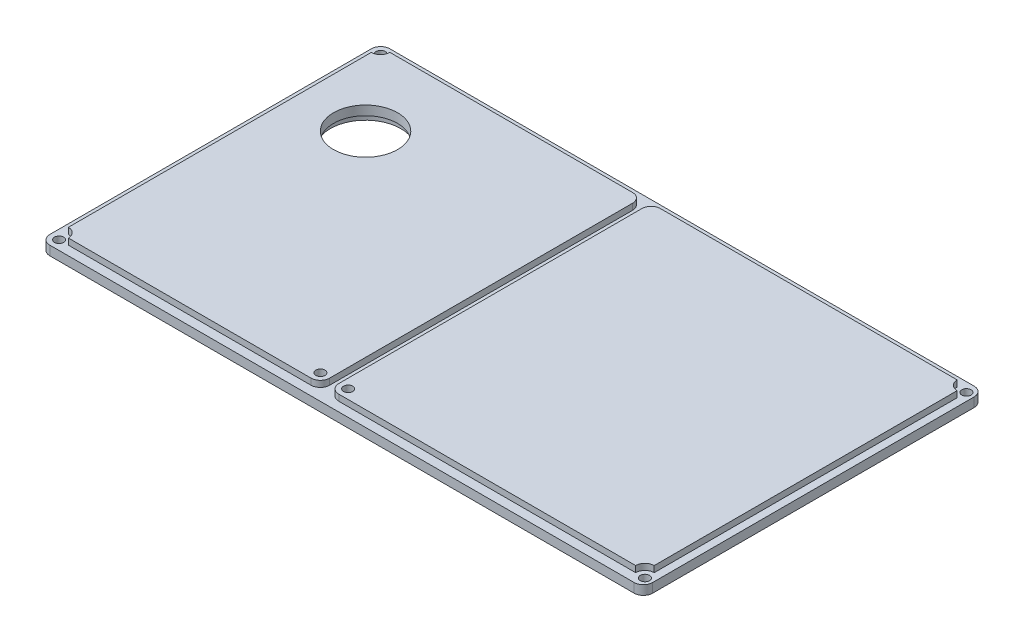
ISO-10303-21;
HEADER;
FILE_DESCRIPTION(('STEP AP214'),'2;1');
FILE_NAME('part.step','',(''),(''),'','','');
FILE_SCHEMA(('AUTOMOTIVE_DESIGN { 1 0 10303 214 1 1 1 1 }'));
ENDSEC;
DATA;
#1=APPLICATION_CONTEXT('core data for automotive mechanical design processes');
#2=APPLICATION_PROTOCOL_DEFINITION('international standard','automotive_design',2000,#1);
#3=PRODUCT_CONTEXT('',#1,'mechanical');
#4=PRODUCT('Part','Part','',(#3));
#5=PRODUCT_RELATED_PRODUCT_CATEGORY('part','',(#4));
#6=PRODUCT_DEFINITION_FORMATION('','',#4);
#7=PRODUCT_DEFINITION_CONTEXT('part definition',#1,'design');
#8=PRODUCT_DEFINITION('design','',#6,#7);
#9=PRODUCT_DEFINITION_SHAPE('','',#8);
#10=(LENGTH_UNIT() NAMED_UNIT(*) SI_UNIT(.MILLI.,.METRE.));
#11=(NAMED_UNIT(*) PLANE_ANGLE_UNIT() SI_UNIT($,.RADIAN.));
#12=(NAMED_UNIT(*) SI_UNIT($,.STERADIAN.) SOLID_ANGLE_UNIT());
#13=UNCERTAINTY_MEASURE_WITH_UNIT(LENGTH_MEASURE(1.E-05),#10,'distance_accuracy_value','');
#14=(GEOMETRIC_REPRESENTATION_CONTEXT(3) GLOBAL_UNCERTAINTY_ASSIGNED_CONTEXT((#13)) GLOBAL_UNIT_ASSIGNED_CONTEXT((#10,
#11,#12)) REPRESENTATION_CONTEXT('',''));
#15=CARTESIAN_POINT('',(0.,0.,0.));
#16=DIRECTION('',(0.,0.,1.));
#17=DIRECTION('',(1.,0.,0.));
#18=AXIS2_PLACEMENT_3D('',#15,#16,#17);
#19=CARTESIAN_POINT('',(-73.375,0.,-26.));
#20=DIRECTION('',(0.,1.,0.));
#21=DIRECTION('',(0.,0.,1.));
#22=AXIS2_PLACEMENT_3D('',#19,#20,#21);
#23=CYLINDRICAL_SURFACE('',#22,10.35);
#24=CARTESIAN_POINT('',(-73.375,5.,-26.));
#25=DIRECTION('',(0.,1.,0.));
#26=DIRECTION('',(0.,0.,1.));
#27=AXIS2_PLACEMENT_3D('',#24,#25,#26);
#28=CIRCLE('',#27,10.35);
#29=CARTESIAN_POINT('',(-73.375,5.,-15.65));
#30=VERTEX_POINT('',#29);
#31=EDGE_CURVE('E718',#30,#30,#28,.T.);
#32=ORIENTED_EDGE('',*,*,#31,.T.);
#33=EDGE_LOOP('',(#32));
#34=FACE_BOUND('',#33,.T.);
#35=CARTESIAN_POINT('',(-73.375,2.,-26.));
#36=DIRECTION('',(0.,-1.,0.));
#37=DIRECTION('',(0.,0.,-1.));
#38=AXIS2_PLACEMENT_3D('',#35,#36,#37);
#39=CIRCLE('',#38,10.35);
#40=CARTESIAN_POINT('',(-73.375,2.,-36.35));
#41=VERTEX_POINT('',#40);
#42=EDGE_CURVE('E41',#41,#41,#39,.F.);
#43=ORIENTED_EDGE('',*,*,#42,.F.);
#44=EDGE_LOOP('',(#43));
#45=FACE_BOUND('',#44,.T.);
#46=ADVANCED_FACE('F37',(#34,#45),#23,.F.);
#47=CARTESIAN_POINT('',(0.,3.,0.));
#48=DIRECTION('',(0.,1.,0.));
#49=DIRECTION('',(0.,0.,1.));
#50=AXIS2_PLACEMENT_3D('',#47,#48,#49);
#51=PLANE('',#50);
#52=CARTESIAN_POINT('',(-94.5,3.,52.));
#53=DIRECTION('',(0.,1.,0.));
#54=DIRECTION('',(0.,0.,1.));
#55=AXIS2_PLACEMENT_3D('',#52,#53,#54);
#56=CIRCLE('',#55,1.5);
#57=CARTESIAN_POINT('',(-94.5,3.,53.5));
#58=VERTEX_POINT('',#57);
#59=EDGE_CURVE('E746',#58,#58,#56,.T.);
#60=ORIENTED_EDGE('',*,*,#59,.F.);
#61=EDGE_LOOP('',(#60));
#62=FACE_BOUND('',#61,.T.);
#63=CARTESIAN_POINT('',(95.,3.,52.));
#64=DIRECTION('',(0.,1.,0.));
#65=DIRECTION('',(0.,0.,1.));
#66=AXIS2_PLACEMENT_3D('',#63,#64,#65);
#67=CIRCLE('',#66,1.5);
#68=CARTESIAN_POINT('',(95.,3.,53.5));
#69=VERTEX_POINT('',#68);
#70=EDGE_CURVE('E740',#69,#69,#67,.T.);
#71=ORIENTED_EDGE('',*,*,#70,.F.);
#72=EDGE_LOOP('',(#71));
#73=FACE_BOUND('',#72,.T.);
#74=CARTESIAN_POINT('',(95.,3.,-52.));
#75=DIRECTION('',(0.,1.,0.));
#76=DIRECTION('',(0.,0.,1.));
#77=AXIS2_PLACEMENT_3D('',#74,#75,#76);
#78=CIRCLE('',#77,1.5);
#79=CARTESIAN_POINT('',(95.,3.,-50.5));
#80=VERTEX_POINT('',#79);
#81=EDGE_CURVE('E733',#80,#80,#78,.T.);
#82=ORIENTED_EDGE('',*,*,#81,.F.);
#83=EDGE_LOOP('',(#82));
#84=FACE_BOUND('',#83,.T.);
#85=CARTESIAN_POINT('',(-94.5,3.,-52.));
#86=DIRECTION('',(0.,1.,0.));
#87=DIRECTION('',(0.,0.,1.));
#88=AXIS2_PLACEMENT_3D('',#85,#86,#87);
#89=CIRCLE('',#88,1.5);
#90=CARTESIAN_POINT('',(-94.5,3.,-50.5));
#91=VERTEX_POINT('',#90);
#92=EDGE_CURVE('E736',#91,#91,#89,.T.);
#93=ORIENTED_EDGE('',*,*,#92,.F.);
#94=EDGE_LOOP('',(#93));
#95=FACE_BOUND('',#94,.T.);
#96=DIRECTION('',(0.,0.,1.));
#97=VECTOR('',#96,1.);
#98=CARTESIAN_POINT('',(-97.5,3.,-55.));
#99=LINE('',#98,#97);
#100=CARTESIAN_POINT('',(-97.5,3.,-52.));
#101=VERTEX_POINT('',#100);
#102=CARTESIAN_POINT('',(-97.5,3.,52.));
#103=VERTEX_POINT('',#102);
#104=EDGE_CURVE('E321',#101,#103,#99,.T.);
#105=ORIENTED_EDGE('',*,*,#104,.T.);
#106=CARTESIAN_POINT('',(-94.5,3.,52.));
#107=DIRECTION('',(0.,1.,0.));
#108=DIRECTION('',(0.,0.,1.));
#109=AXIS2_PLACEMENT_3D('',#106,#107,#108);
#110=CIRCLE('',#109,3.);
#111=CARTESIAN_POINT('',(-94.5,3.,55.));
#112=VERTEX_POINT('',#111);
#113=EDGE_CURVE('E359',#103,#112,#110,.T.);
#114=ORIENTED_EDGE('',*,*,#113,.T.);
#115=DIRECTION('',(1.,0.,0.));
#116=VECTOR('',#115,1.);
#117=CARTESIAN_POINT('',(-97.5,3.,55.));
#118=LINE('',#117,#116);
#119=CARTESIAN_POINT('',(94.5,3.,55.));
#120=VERTEX_POINT('',#119);
#121=EDGE_CURVE('E324',#112,#120,#118,.T.);
#122=ORIENTED_EDGE('',*,*,#121,.T.);
#123=CARTESIAN_POINT('',(94.5,3.,52.));
#124=DIRECTION('',(0.,1.,0.));
#125=DIRECTION('',(0.,0.,1.));
#126=AXIS2_PLACEMENT_3D('',#123,#124,#125);
#127=CIRCLE('',#126,3.);
#128=CARTESIAN_POINT('',(97.5,3.,52.));
#129=VERTEX_POINT('',#128);
#130=EDGE_CURVE('E357',#120,#129,#127,.T.);
#131=ORIENTED_EDGE('',*,*,#130,.T.);
#132=DIRECTION('',(0.,0.,-1.));
#133=VECTOR('',#132,1.);
#134=CARTESIAN_POINT('',(97.5,3.,-55.));
#135=LINE('',#134,#133);
#136=CARTESIAN_POINT('',(97.5,3.,-52.));
#137=VERTEX_POINT('',#136);
#138=EDGE_CURVE('E316',#129,#137,#135,.T.);
#139=ORIENTED_EDGE('',*,*,#138,.T.);
#140=CARTESIAN_POINT('',(94.5,3.,-52.));
#141=DIRECTION('',(0.,1.,0.));
#142=DIRECTION('',(0.,0.,1.));
#143=AXIS2_PLACEMENT_3D('',#140,#141,#142);
#144=CIRCLE('',#143,3.);
#145=CARTESIAN_POINT('',(94.5,3.,-55.));
#146=VERTEX_POINT('',#145);
#147=EDGE_CURVE('E59',#137,#146,#144,.T.);
#148=ORIENTED_EDGE('',*,*,#147,.T.);
#149=DIRECTION('',(-1.,0.,0.));
#150=VECTOR('',#149,1.);
#151=CARTESIAN_POINT('',(-97.5,3.,-55.));
#152=LINE('',#151,#150);
#153=CARTESIAN_POINT('',(-94.5,3.,-55.));
#154=VERTEX_POINT('',#153);
#155=EDGE_CURVE('E318',#146,#154,#152,.T.);
#156=ORIENTED_EDGE('',*,*,#155,.T.);
#157=CARTESIAN_POINT('',(-94.5,3.,-52.));
#158=DIRECTION('',(0.,1.,0.));
#159=DIRECTION('',(0.,0.,1.));
#160=AXIS2_PLACEMENT_3D('',#157,#158,#159);
#161=CIRCLE('',#160,3.);
#162=EDGE_CURVE('E354',#154,#101,#161,.T.);
#163=ORIENTED_EDGE('',*,*,#162,.T.);
#164=EDGE_LOOP('',(#105,#114,#122,#131,#139,#148,#156,#163));
#165=FACE_BOUND('',#164,.T.);
#166=DIRECTION('',(1.,0.,0.));
#167=VECTOR('',#166,1.);
#168=CARTESIAN_POINT('',(-13.,3.,52.));
#169=LINE('',#168,#167);
#170=CARTESIAN_POINT('',(-91.4999999999999,3.,52.));
#171=VERTEX_POINT('',#170);
#172=CARTESIAN_POINT('',(-13.,3.,52.));
#173=VERTEX_POINT('',#172);
#174=EDGE_CURVE('E279',#171,#173,#169,.T.);
#175=ORIENTED_EDGE('',*,*,#174,.F.);
#176=CARTESIAN_POINT('',(-94.5,3.,52.));
#177=DIRECTION('',(0.,-1.,0.));
#178=DIRECTION('',(0.,0.,1.));
#179=AXIS2_PLACEMENT_3D('',#176,#177,#178);
#180=CIRCLE('',#179,3.00000000000002);
#181=CARTESIAN_POINT('',(-94.5,3.,49.));
#182=VERTEX_POINT('',#181);
#183=EDGE_CURVE('E242',#182,#171,#180,.T.);
#184=ORIENTED_EDGE('',*,*,#183,.F.);
#185=DIRECTION('',(0.,0.,1.));
#186=VECTOR('',#185,1.);
#187=CARTESIAN_POINT('',(-94.5,3.,0.));
#188=LINE('',#187,#186);
#189=CARTESIAN_POINT('',(-94.5,3.,-49.));
#190=VERTEX_POINT('',#189);
#191=EDGE_CURVE('E262',#190,#182,#188,.T.);
#192=ORIENTED_EDGE('',*,*,#191,.F.);
#193=CARTESIAN_POINT('',(-94.5,3.,-52.));
#194=DIRECTION('',(0.,-1.,0.));
#195=DIRECTION('',(0.,0.,1.));
#196=AXIS2_PLACEMENT_3D('',#193,#194,#195);
#197=CIRCLE('',#196,3.00000000000002);
#198=CARTESIAN_POINT('',(-91.4999999999999,3.,-52.));
#199=VERTEX_POINT('',#198);
#200=EDGE_CURVE('E289',#199,#190,#197,.T.);
#201=ORIENTED_EDGE('',*,*,#200,.F.);
#202=DIRECTION('',(-1.,0.,0.));
#203=VECTOR('',#202,1.);
#204=CARTESIAN_POINT('',(-91.4999999999999,3.,-52.));
#205=LINE('',#204,#203);
#206=CARTESIAN_POINT('',(-13.,3.,-52.));
#207=VERTEX_POINT('',#206);
#208=EDGE_CURVE('E287',#207,#199,#205,.T.);
#209=ORIENTED_EDGE('',*,*,#208,.F.);
#210=CARTESIAN_POINT('',(-13.,3.,-49.));
#211=DIRECTION('',(0.,1.,0.));
#212=DIRECTION('',(0.,0.,-1.));
#213=AXIS2_PLACEMENT_3D('',#210,#211,#212);
#214=CIRCLE('',#213,3.);
#215=CARTESIAN_POINT('',(-9.99999999999997,3.,-49.));
#216=VERTEX_POINT('',#215);
#217=EDGE_CURVE('E285',#216,#207,#214,.T.);
#218=ORIENTED_EDGE('',*,*,#217,.F.);
#219=DIRECTION('',(0.,0.,-1.));
#220=VECTOR('',#219,1.);
#221=CARTESIAN_POINT('',(-9.99999999999997,3.,-49.));
#222=LINE('',#221,#220);
#223=CARTESIAN_POINT('',(-9.99999999999995,3.,49.));
#224=VERTEX_POINT('',#223);
#225=EDGE_CURVE('E283',#224,#216,#222,.T.);
#226=ORIENTED_EDGE('',*,*,#225,.F.);
#227=CARTESIAN_POINT('',(-13.,3.,49.));
#228=DIRECTION('',(0.,1.,0.));
#229=DIRECTION('',(0.,0.,1.));
#230=AXIS2_PLACEMENT_3D('',#227,#228,#229);
#231=CIRCLE('',#230,3.);
#232=EDGE_CURVE('E281',#173,#224,#231,.T.);
#233=ORIENTED_EDGE('',*,*,#232,.F.);
#234=EDGE_LOOP('',(#175,#184,#192,#201,#209,#218,#226,#233));
#235=FACE_BOUND('',#234,.T.);
#236=DIRECTION('',(1.,0.,0.));
#237=VECTOR('',#236,1.);
#238=CARTESIAN_POINT('',(-3.99999999999994,3.,52.));
#239=LINE('',#238,#237);
#240=CARTESIAN_POINT('',(-3.99999999999994,3.,52.));
#241=VERTEX_POINT('',#240);
#242=CARTESIAN_POINT('',(92.,3.,52.));
#243=VERTEX_POINT('',#242);
#244=EDGE_CURVE('E238',#241,#243,#239,.T.);
#245=ORIENTED_EDGE('',*,*,#244,.F.);
#246=CARTESIAN_POINT('',(-3.99999999999996,3.,49.));
#247=DIRECTION('',(0.,1.,0.));
#248=DIRECTION('',(0.,0.,1.));
#249=AXIS2_PLACEMENT_3D('',#246,#247,#248);
#250=CIRCLE('',#249,3.);
#251=CARTESIAN_POINT('',(-6.99999999999996,3.,49.));
#252=VERTEX_POINT('',#251);
#253=EDGE_CURVE('E240',#252,#241,#250,.T.);
#254=ORIENTED_EDGE('',*,*,#253,.F.);
#255=DIRECTION('',(0.,0.,1.));
#256=VECTOR('',#255,1.);
#257=CARTESIAN_POINT('',(-6.99999999999996,3.,0.));
#258=LINE('',#257,#256);
#259=CARTESIAN_POINT('',(-6.99999999999996,3.,-49.));
#260=VERTEX_POINT('',#259);
#261=EDGE_CURVE('E227',#260,#252,#258,.T.);
#262=ORIENTED_EDGE('',*,*,#261,.F.);
#263=CARTESIAN_POINT('',(-3.99999999999996,3.,-49.));
#264=DIRECTION('',(0.,1.,0.));
#265=DIRECTION('',(0.,0.,1.));
#266=AXIS2_PLACEMENT_3D('',#263,#264,#265);
#267=CIRCLE('',#266,3.);
#268=CARTESIAN_POINT('',(-3.99999999999994,3.,-52.));
#269=VERTEX_POINT('',#268);
#270=EDGE_CURVE('E213',#269,#260,#267,.T.);
#271=ORIENTED_EDGE('',*,*,#270,.F.);
#272=DIRECTION('',(-1.,0.,0.));
#273=VECTOR('',#272,1.);
#274=CARTESIAN_POINT('',(-3.99999999999994,3.,-52.));
#275=LINE('',#274,#273);
#276=CARTESIAN_POINT('',(92.,3.,-52.));
#277=VERTEX_POINT('',#276);
#278=EDGE_CURVE('E201',#277,#269,#275,.T.);
#279=ORIENTED_EDGE('',*,*,#278,.F.);
#280=CARTESIAN_POINT('',(95.,3.,-52.));
#281=DIRECTION('',(0.,-1.,0.));
#282=DIRECTION('',(0.,0.,1.));
#283=AXIS2_PLACEMENT_3D('',#280,#281,#282);
#284=CIRCLE('',#283,3.00000000000002);
#285=CARTESIAN_POINT('',(95.,3.,-49.));
#286=VERTEX_POINT('',#285);
#287=EDGE_CURVE('E212',#286,#277,#284,.T.);
#288=ORIENTED_EDGE('',*,*,#287,.F.);
#289=DIRECTION('',(0.,0.,-1.));
#290=VECTOR('',#289,1.);
#291=CARTESIAN_POINT('',(95.,3.,-49.));
#292=LINE('',#291,#290);
#293=CARTESIAN_POINT('',(95.,3.,49.));
#294=VERTEX_POINT('',#293);
#295=EDGE_CURVE('E234',#294,#286,#292,.T.);
#296=ORIENTED_EDGE('',*,*,#295,.F.);
#297=CARTESIAN_POINT('',(95.,3.,52.));
#298=DIRECTION('',(0.,-1.,0.));
#299=DIRECTION('',(0.,0.,1.));
#300=AXIS2_PLACEMENT_3D('',#297,#298,#299);
#301=CIRCLE('',#300,3.00000000000002);
#302=EDGE_CURVE('E236',#243,#294,#301,.T.);
#303=ORIENTED_EDGE('',*,*,#302,.F.);
#304=EDGE_LOOP('',(#245,#254,#262,#271,#279,#288,#296,#303));
#305=FACE_BOUND('',#304,.T.);
#306=ADVANCED_FACE('F225',(#62,#73,#84,#95,#165,#235,#305),#51,.T.);
#307=CARTESIAN_POINT('',(97.5,3.,-55.));
#308=DIRECTION('',(-1.,0.,0.));
#309=DIRECTION('',(0.,0.,1.));
#310=AXIS2_PLACEMENT_3D('',#307,#308,#309);
#311=PLANE('',#310);
#312=ORIENTED_EDGE('',*,*,#138,.F.);
#313=DIRECTION('',(0.,-1.,0.));
#314=VECTOR('',#313,1.);
#315=CARTESIAN_POINT('',(97.5,3.,52.));
#316=LINE('',#315,#314);
#317=CARTESIAN_POINT('',(97.5,0.,52.));
#318=VERTEX_POINT('',#317);
#319=EDGE_CURVE('E363',#129,#318,#316,.T.);
#320=ORIENTED_EDGE('',*,*,#319,.T.);
#321=DIRECTION('',(0.,0.,-1.));
#322=VECTOR('',#321,1.);
#323=CARTESIAN_POINT('',(97.5,0.,-55.));
#324=LINE('',#323,#322);
#325=CARTESIAN_POINT('',(97.5,0.,-52.));
#326=VERTEX_POINT('',#325);
#327=EDGE_CURVE('E315',#318,#326,#324,.T.);
#328=ORIENTED_EDGE('',*,*,#327,.T.);
#329=DIRECTION('',(0.,-1.,0.));
#330=VECTOR('',#329,1.);
#331=CARTESIAN_POINT('',(97.5,3.,-52.));
#332=LINE('',#331,#330);
#333=EDGE_CURVE('E361',#326,#137,#332,.F.);
#334=ORIENTED_EDGE('',*,*,#333,.T.);
#335=EDGE_LOOP('',(#312,#320,#328,#334));
#336=FACE_BOUND('',#335,.T.);
#337=ADVANCED_FACE('F370',(#336),#311,.F.);
#338=CARTESIAN_POINT('',(-97.5,3.,-55.));
#339=DIRECTION('',(0.,0.,1.));
#340=DIRECTION('',(1.,0.,0.));
#341=AXIS2_PLACEMENT_3D('',#338,#339,#340);
#342=PLANE('',#341);
#343=ORIENTED_EDGE('',*,*,#155,.F.);
#344=DIRECTION('',(0.,-1.,0.));
#345=VECTOR('',#344,1.);
#346=CARTESIAN_POINT('',(94.5,3.,-55.));
#347=LINE('',#346,#345);
#348=CARTESIAN_POINT('',(94.5,0.,-55.));
#349=VERTEX_POINT('',#348);
#350=EDGE_CURVE('E11',#146,#349,#347,.T.);
#351=ORIENTED_EDGE('',*,*,#350,.T.);
#352=DIRECTION('',(-1.,0.,0.));
#353=VECTOR('',#352,1.);
#354=CARTESIAN_POINT('',(-97.5,0.,-55.));
#355=LINE('',#354,#353);
#356=CARTESIAN_POINT('',(-94.5,0.,-55.));
#357=VERTEX_POINT('',#356);
#358=EDGE_CURVE('E330',#349,#357,#355,.T.);
#359=ORIENTED_EDGE('',*,*,#358,.T.);
#360=DIRECTION('',(0.,-1.,0.));
#361=VECTOR('',#360,1.);
#362=CARTESIAN_POINT('',(-94.5,3.,-55.));
#363=LINE('',#362,#361);
#364=EDGE_CURVE('E46',#357,#154,#363,.F.);
#365=ORIENTED_EDGE('',*,*,#364,.T.);
#366=EDGE_LOOP('',(#343,#351,#359,#365));
#367=FACE_BOUND('',#366,.T.);
#368=ADVANCED_FACE('F381',(#367),#342,.F.);
#369=CARTESIAN_POINT('',(-97.5,3.,-55.));
#370=DIRECTION('',(1.,0.,0.));
#371=DIRECTION('',(0.,0.,-1.));
#372=AXIS2_PLACEMENT_3D('',#369,#370,#371);
#373=PLANE('',#372);
#374=DIRECTION('',(0.,0.,1.));
#375=VECTOR('',#374,1.);
#376=CARTESIAN_POINT('',(-97.5,0.,-55.));
#377=LINE('',#376,#375);
#378=CARTESIAN_POINT('',(-97.5,0.,-52.));
#379=VERTEX_POINT('',#378);
#380=CARTESIAN_POINT('',(-97.5,0.,52.));
#381=VERTEX_POINT('',#380);
#382=EDGE_CURVE('E332',#379,#381,#377,.T.);
#383=ORIENTED_EDGE('',*,*,#382,.T.);
#384=DIRECTION('',(0.,-1.,0.));
#385=VECTOR('',#384,1.);
#386=CARTESIAN_POINT('',(-97.5,3.,52.));
#387=LINE('',#386,#385);
#388=EDGE_CURVE('E352',#381,#103,#387,.F.);
#389=ORIENTED_EDGE('',*,*,#388,.T.);
#390=ORIENTED_EDGE('',*,*,#104,.F.);
#391=DIRECTION('',(0.,-1.,0.));
#392=VECTOR('',#391,1.);
#393=CARTESIAN_POINT('',(-97.5,3.,-52.));
#394=LINE('',#393,#392);
#395=EDGE_CURVE('E349',#101,#379,#394,.T.);
#396=ORIENTED_EDGE('',*,*,#395,.T.);
#397=EDGE_LOOP('',(#383,#389,#390,#396));
#398=FACE_BOUND('',#397,.T.);
#399=ADVANCED_FACE('F389',(#398),#373,.F.);
#400=CARTESIAN_POINT('',(-97.5,3.,55.));
#401=DIRECTION('',(0.,0.,-1.));
#402=DIRECTION('',(-1.,0.,0.));
#403=AXIS2_PLACEMENT_3D('',#400,#401,#402);
#404=PLANE('',#403);
#405=ORIENTED_EDGE('',*,*,#121,.F.);
#406=DIRECTION('',(0.,-1.,0.));
#407=VECTOR('',#406,1.);
#408=CARTESIAN_POINT('',(-94.5,3.,55.));
#409=LINE('',#408,#407);
#410=CARTESIAN_POINT('',(-94.5,0.,55.));
#411=VERTEX_POINT('',#410);
#412=EDGE_CURVE('E338',#112,#411,#409,.T.);
#413=ORIENTED_EDGE('',*,*,#412,.T.);
#414=DIRECTION('',(1.,0.,0.));
#415=VECTOR('',#414,1.);
#416=CARTESIAN_POINT('',(-97.5,0.,55.));
#417=LINE('',#416,#415);
#418=CARTESIAN_POINT('',(94.5,0.,55.));
#419=VERTEX_POINT('',#418);
#420=EDGE_CURVE('E319',#411,#419,#417,.T.);
#421=ORIENTED_EDGE('',*,*,#420,.T.);
#422=DIRECTION('',(0.,-1.,0.));
#423=VECTOR('',#422,1.);
#424=CARTESIAN_POINT('',(94.5,3.,55.));
#425=LINE('',#424,#423);
#426=EDGE_CURVE('E327',#419,#120,#425,.F.);
#427=ORIENTED_EDGE('',*,*,#426,.T.);
#428=EDGE_LOOP('',(#405,#413,#421,#427));
#429=FACE_BOUND('',#428,.T.);
#430=ADVANCED_FACE('F397',(#429),#404,.F.);
#431=CARTESIAN_POINT('',(0.,0.,0.));
#432=DIRECTION('',(0.,1.,0.));
#433=DIRECTION('',(0.,0.,1.));
#434=AXIS2_PLACEMENT_3D('',#431,#432,#433);
#435=PLANE('',#434);
#436=CARTESIAN_POINT('',(-73.375,0.,-26.));
#437=DIRECTION('',(0.,-1.,0.));
#438=DIRECTION('',(0.,0.,-1.));
#439=AXIS2_PLACEMENT_3D('',#436,#437,#438);
#440=CIRCLE('',#439,11.4);
#441=CARTESIAN_POINT('',(-73.375,0.,-37.4));
#442=VERTEX_POINT('',#441);
#443=EDGE_CURVE('E714',#442,#442,#440,.T.);
#444=ORIENTED_EDGE('',*,*,#443,.F.);
#445=EDGE_LOOP('',(#444));
#446=FACE_BOUND('',#445,.T.);
#447=CARTESIAN_POINT('',(-13.,0.,49.));
#448=DIRECTION('',(0.,1.,0.));
#449=DIRECTION('',(0.,0.,1.));
#450=AXIS2_PLACEMENT_3D('',#447,#448,#449);
#451=CIRCLE('',#450,1.5);
#452=CARTESIAN_POINT('',(-13.,0.,50.5));
#453=VERTEX_POINT('',#452);
#454=EDGE_CURVE('E721',#453,#453,#451,.T.);
#455=ORIENTED_EDGE('',*,*,#454,.T.);
#456=EDGE_LOOP('',(#455));
#457=FACE_BOUND('',#456,.T.);
#458=CARTESIAN_POINT('',(-3.99999999999996,0.,49.));
#459=DIRECTION('',(0.,1.,0.));
#460=DIRECTION('',(0.,0.,1.));
#461=AXIS2_PLACEMENT_3D('',#458,#459,#460);
#462=CIRCLE('',#461,1.5);
#463=CARTESIAN_POINT('',(-3.99999999999996,0.,50.5));
#464=VERTEX_POINT('',#463);
#465=EDGE_CURVE('E720',#464,#464,#462,.T.);
#466=ORIENTED_EDGE('',*,*,#465,.T.);
#467=EDGE_LOOP('',(#466));
#468=FACE_BOUND('',#467,.T.);
#469=CARTESIAN_POINT('',(-94.5,0.,52.));
#470=DIRECTION('',(0.,1.,0.));
#471=DIRECTION('',(0.,0.,1.));
#472=AXIS2_PLACEMENT_3D('',#469,#470,#471);
#473=CIRCLE('',#472,1.5);
#474=CARTESIAN_POINT('',(-94.5,0.,53.5));
#475=VERTEX_POINT('',#474);
#476=EDGE_CURVE('E724',#475,#475,#473,.T.);
#477=ORIENTED_EDGE('',*,*,#476,.T.);
#478=EDGE_LOOP('',(#477));
#479=FACE_BOUND('',#478,.T.);
#480=CARTESIAN_POINT('',(95.,0.,52.));
#481=DIRECTION('',(0.,1.,0.));
#482=DIRECTION('',(0.,0.,1.));
#483=AXIS2_PLACEMENT_3D('',#480,#481,#482);
#484=CIRCLE('',#483,1.5);
#485=CARTESIAN_POINT('',(95.,0.,53.5));
#486=VERTEX_POINT('',#485);
#487=EDGE_CURVE('E743',#486,#486,#484,.T.);
#488=ORIENTED_EDGE('',*,*,#487,.T.);
#489=EDGE_LOOP('',(#488));
#490=FACE_BOUND('',#489,.T.);
#491=CARTESIAN_POINT('',(95.,0.,-52.));
#492=DIRECTION('',(0.,1.,0.));
#493=DIRECTION('',(0.,0.,1.));
#494=AXIS2_PLACEMENT_3D('',#491,#492,#493);
#495=CIRCLE('',#494,1.5);
#496=CARTESIAN_POINT('',(95.,0.,-50.5));
#497=VERTEX_POINT('',#496);
#498=EDGE_CURVE('E737',#497,#497,#495,.T.);
#499=ORIENTED_EDGE('',*,*,#498,.T.);
#500=EDGE_LOOP('',(#499));
#501=FACE_BOUND('',#500,.T.);
#502=CARTESIAN_POINT('',(-94.5,0.,-52.));
#503=DIRECTION('',(0.,1.,0.));
#504=DIRECTION('',(0.,0.,1.));
#505=AXIS2_PLACEMENT_3D('',#502,#503,#504);
#506=CIRCLE('',#505,1.5);
#507=CARTESIAN_POINT('',(-94.5,0.,-50.5));
#508=VERTEX_POINT('',#507);
#509=EDGE_CURVE('E751',#508,#508,#506,.T.);
#510=ORIENTED_EDGE('',*,*,#509,.T.);
#511=EDGE_LOOP('',(#510));
#512=FACE_BOUND('',#511,.T.);
#513=ORIENTED_EDGE('',*,*,#420,.F.);
#514=CARTESIAN_POINT('',(-94.5,0.,52.));
#515=DIRECTION('',(0.,1.,0.));
#516=DIRECTION('',(0.,0.,1.));
#517=AXIS2_PLACEMENT_3D('',#514,#515,#516);
#518=CIRCLE('',#517,3.);
#519=EDGE_CURVE('E347',#411,#381,#518,.F.);
#520=ORIENTED_EDGE('',*,*,#519,.T.);
#521=ORIENTED_EDGE('',*,*,#382,.F.);
#522=CARTESIAN_POINT('',(-94.5,0.,-52.));
#523=DIRECTION('',(0.,1.,0.));
#524=DIRECTION('',(0.,0.,1.));
#525=AXIS2_PLACEMENT_3D('',#522,#523,#524);
#526=CIRCLE('',#525,3.);
#527=EDGE_CURVE('E341',#379,#357,#526,.F.);
#528=ORIENTED_EDGE('',*,*,#527,.T.);
#529=ORIENTED_EDGE('',*,*,#358,.F.);
#530=CARTESIAN_POINT('',(94.5,0.,-52.));
#531=DIRECTION('',(0.,1.,0.));
#532=DIRECTION('',(0.,0.,1.));
#533=AXIS2_PLACEMENT_3D('',#530,#531,#532);
#534=CIRCLE('',#533,3.);
#535=EDGE_CURVE('E343',#349,#326,#534,.F.);
#536=ORIENTED_EDGE('',*,*,#535,.T.);
#537=ORIENTED_EDGE('',*,*,#327,.F.);
#538=CARTESIAN_POINT('',(94.5,0.,52.));
#539=DIRECTION('',(0.,1.,0.));
#540=DIRECTION('',(0.,0.,1.));
#541=AXIS2_PLACEMENT_3D('',#538,#539,#540);
#542=CIRCLE('',#541,3.);
#543=EDGE_CURVE('E345',#318,#419,#542,.F.);
#544=ORIENTED_EDGE('',*,*,#543,.T.);
#545=EDGE_LOOP('',(#513,#520,#521,#528,#529,#536,#537,#544));
#546=FACE_BOUND('',#545,.T.);
#547=ADVANCED_FACE('F376',(#446,#457,#468,#479,#490,#501,#512,#546),#435,.F.);
#548=CARTESIAN_POINT('',(-94.5,5.,52.));
#549=DIRECTION('',(0.,-1.,0.));
#550=DIRECTION('',(0.,0.,-1.));
#551=AXIS2_PLACEMENT_3D('',#548,#549,#550);
#552=CYLINDRICAL_SURFACE('',#551,3.00000000000002);
#553=ORIENTED_EDGE('',*,*,#183,.T.);
#554=DIRECTION('',(0.,-1.,0.));
#555=VECTOR('',#554,1.);
#556=CARTESIAN_POINT('',(-91.4999999999999,5.,52.));
#557=LINE('',#556,#555);
#558=CARTESIAN_POINT('',(-91.4999999999999,5.,52.));
#559=VERTEX_POINT('',#558);
#560=EDGE_CURVE('E309',#559,#171,#557,.T.);
#561=ORIENTED_EDGE('',*,*,#560,.F.);
#562=CARTESIAN_POINT('',(-94.5,5.,52.));
#563=DIRECTION('',(0.,-1.,0.));
#564=DIRECTION('',(0.,0.,1.));
#565=AXIS2_PLACEMENT_3D('',#562,#563,#564);
#566=CIRCLE('',#565,3.00000000000002);
#567=CARTESIAN_POINT('',(-94.5,5.,49.));
#568=VERTEX_POINT('',#567);
#569=EDGE_CURVE('E261',#568,#559,#566,.T.);
#570=ORIENTED_EDGE('',*,*,#569,.F.);
#571=DIRECTION('',(0.,-1.,0.));
#572=VECTOR('',#571,1.);
#573=CARTESIAN_POINT('',(-94.5,5.,49.));
#574=LINE('',#573,#572);
#575=EDGE_CURVE('E312',#568,#182,#574,.T.);
#576=ORIENTED_EDGE('',*,*,#575,.T.);
#577=EDGE_LOOP('',(#553,#561,#570,#576));
#578=FACE_BOUND('',#577,.T.);
#579=ADVANCED_FACE('F510',(#578),#552,.F.);
#580=CARTESIAN_POINT('',(-13.,5.,52.));
#581=DIRECTION('',(0.,0.,-1.));
#582=DIRECTION('',(-1.,0.,0.));
#583=AXIS2_PLACEMENT_3D('',#580,#581,#582);
#584=PLANE('',#583);
#585=ORIENTED_EDGE('',*,*,#174,.T.);
#586=DIRECTION('',(0.,-1.,0.));
#587=VECTOR('',#586,1.);
#588=CARTESIAN_POINT('',(-13.,5.,52.));
#589=LINE('',#588,#587);
#590=CARTESIAN_POINT('',(-13.,5.,52.));
#591=VERTEX_POINT('',#590);
#592=EDGE_CURVE('E306',#591,#173,#589,.T.);
#593=ORIENTED_EDGE('',*,*,#592,.F.);
#594=DIRECTION('',(1.,0.,0.));
#595=VECTOR('',#594,1.);
#596=CARTESIAN_POINT('',(-13.,5.,52.));
#597=LINE('',#596,#595);
#598=EDGE_CURVE('E264',#559,#591,#597,.T.);
#599=ORIENTED_EDGE('',*,*,#598,.F.);
#600=ORIENTED_EDGE('',*,*,#560,.T.);
#601=EDGE_LOOP('',(#585,#593,#599,#600));
#602=FACE_BOUND('',#601,.T.);
#603=ADVANCED_FACE('F506',(#602),#584,.F.);
#604=CARTESIAN_POINT('',(-13.,5.,49.));
#605=DIRECTION('',(0.,-1.,0.));
#606=DIRECTION('',(0.,0.,-1.));
#607=AXIS2_PLACEMENT_3D('',#604,#605,#606);
#608=CYLINDRICAL_SURFACE('',#607,3.);
#609=ORIENTED_EDGE('',*,*,#232,.T.);
#610=DIRECTION('',(0.,-1.,0.));
#611=VECTOR('',#610,1.);
#612=CARTESIAN_POINT('',(-9.99999999999995,5.,49.));
#613=LINE('',#612,#611);
#614=CARTESIAN_POINT('',(-9.99999999999995,5.,49.));
#615=VERTEX_POINT('',#614);
#616=EDGE_CURVE('E303',#615,#224,#613,.T.);
#617=ORIENTED_EDGE('',*,*,#616,.F.);
#618=CARTESIAN_POINT('',(-13.,5.,49.));
#619=DIRECTION('',(0.,1.,0.));
#620=DIRECTION('',(0.,0.,1.));
#621=AXIS2_PLACEMENT_3D('',#618,#619,#620);
#622=CIRCLE('',#621,3.);
#623=EDGE_CURVE('E266',#591,#615,#622,.T.);
#624=ORIENTED_EDGE('',*,*,#623,.F.);
#625=ORIENTED_EDGE('',*,*,#592,.T.);
#626=EDGE_LOOP('',(#609,#617,#624,#625));
#627=FACE_BOUND('',#626,.T.);
#628=ADVANCED_FACE('F502',(#627),#608,.T.);
#629=CARTESIAN_POINT('',(-9.99999999999997,5.,-49.));
#630=DIRECTION('',(-1.,0.,0.));
#631=DIRECTION('',(0.,0.,1.));
#632=AXIS2_PLACEMENT_3D('',#629,#630,#631);
#633=PLANE('',#632);
#634=ORIENTED_EDGE('',*,*,#225,.T.);
#635=DIRECTION('',(0.,-1.,0.));
#636=VECTOR('',#635,1.);
#637=CARTESIAN_POINT('',(-9.99999999999997,5.,-49.));
#638=LINE('',#637,#636);
#639=CARTESIAN_POINT('',(-9.99999999999997,5.,-49.));
#640=VERTEX_POINT('',#639);
#641=EDGE_CURVE('E300',#640,#216,#638,.T.);
#642=ORIENTED_EDGE('',*,*,#641,.F.);
#643=DIRECTION('',(0.,0.,-1.));
#644=VECTOR('',#643,1.);
#645=CARTESIAN_POINT('',(-9.99999999999997,5.,-49.));
#646=LINE('',#645,#644);
#647=EDGE_CURVE('E268',#615,#640,#646,.T.);
#648=ORIENTED_EDGE('',*,*,#647,.F.);
#649=ORIENTED_EDGE('',*,*,#616,.T.);
#650=EDGE_LOOP('',(#634,#642,#648,#649));
#651=FACE_BOUND('',#650,.T.);
#652=ADVANCED_FACE('F498',(#651),#633,.F.);
#653=CARTESIAN_POINT('',(-13.,5.,-49.));
#654=DIRECTION('',(0.,-1.,0.));
#655=DIRECTION('',(0.,0.,-1.));
#656=AXIS2_PLACEMENT_3D('',#653,#654,#655);
#657=CYLINDRICAL_SURFACE('',#656,3.);
#658=ORIENTED_EDGE('',*,*,#217,.T.);
#659=DIRECTION('',(0.,-1.,0.));
#660=VECTOR('',#659,1.);
#661=CARTESIAN_POINT('',(-13.,5.,-52.));
#662=LINE('',#661,#660);
#663=CARTESIAN_POINT('',(-13.,5.,-52.));
#664=VERTEX_POINT('',#663);
#665=EDGE_CURVE('E297',#664,#207,#662,.T.);
#666=ORIENTED_EDGE('',*,*,#665,.F.);
#667=CARTESIAN_POINT('',(-13.,5.,-49.));
#668=DIRECTION('',(0.,1.,0.));
#669=DIRECTION('',(0.,0.,-1.));
#670=AXIS2_PLACEMENT_3D('',#667,#668,#669);
#671=CIRCLE('',#670,3.);
#672=EDGE_CURVE('E270',#640,#664,#671,.T.);
#673=ORIENTED_EDGE('',*,*,#672,.F.);
#674=ORIENTED_EDGE('',*,*,#641,.T.);
#675=EDGE_LOOP('',(#658,#666,#673,#674));
#676=FACE_BOUND('',#675,.T.);
#677=ADVANCED_FACE('F494',(#676),#657,.T.);
#678=CARTESIAN_POINT('',(-91.4999999999999,5.,-52.));
#679=DIRECTION('',(0.,0.,1.));
#680=DIRECTION('',(1.,0.,0.));
#681=AXIS2_PLACEMENT_3D('',#678,#679,#680);
#682=PLANE('',#681);
#683=ORIENTED_EDGE('',*,*,#208,.T.);
#684=DIRECTION('',(0.,-1.,0.));
#685=VECTOR('',#684,1.);
#686=CARTESIAN_POINT('',(-91.4999999999999,5.,-52.));
#687=LINE('',#686,#685);
#688=CARTESIAN_POINT('',(-91.4999999999999,5.,-52.));
#689=VERTEX_POINT('',#688);
#690=EDGE_CURVE('E294',#689,#199,#687,.T.);
#691=ORIENTED_EDGE('',*,*,#690,.F.);
#692=DIRECTION('',(-1.,0.,0.));
#693=VECTOR('',#692,1.);
#694=CARTESIAN_POINT('',(-91.4999999999999,5.,-52.));
#695=LINE('',#694,#693);
#696=EDGE_CURVE('E272',#664,#689,#695,.T.);
#697=ORIENTED_EDGE('',*,*,#696,.F.);
#698=ORIENTED_EDGE('',*,*,#665,.T.);
#699=EDGE_LOOP('',(#683,#691,#697,#698));
#700=FACE_BOUND('',#699,.T.);
#701=ADVANCED_FACE('F490',(#700),#682,.F.);
#702=CARTESIAN_POINT('',(-94.5,5.,-52.));
#703=DIRECTION('',(0.,-1.,0.));
#704=DIRECTION('',(0.,0.,-1.));
#705=AXIS2_PLACEMENT_3D('',#702,#703,#704);
#706=CYLINDRICAL_SURFACE('',#705,3.00000000000002);
#707=ORIENTED_EDGE('',*,*,#200,.T.);
#708=DIRECTION('',(0.,-1.,0.));
#709=VECTOR('',#708,1.);
#710=CARTESIAN_POINT('',(-94.5,5.,-49.));
#711=LINE('',#710,#709);
#712=CARTESIAN_POINT('',(-94.5,5.,-49.));
#713=VERTEX_POINT('',#712);
#714=EDGE_CURVE('E277',#713,#190,#711,.T.);
#715=ORIENTED_EDGE('',*,*,#714,.F.);
#716=CARTESIAN_POINT('',(-94.5,5.,-52.));
#717=DIRECTION('',(0.,-1.,0.));
#718=DIRECTION('',(0.,0.,1.));
#719=AXIS2_PLACEMENT_3D('',#716,#717,#718);
#720=CIRCLE('',#719,3.00000000000002);
#721=EDGE_CURVE('E274',#689,#713,#720,.T.);
#722=ORIENTED_EDGE('',*,*,#721,.F.);
#723=ORIENTED_EDGE('',*,*,#690,.T.);
#724=EDGE_LOOP('',(#707,#715,#722,#723));
#725=FACE_BOUND('',#724,.T.);
#726=ADVANCED_FACE('F486',(#725),#706,.F.);
#727=CARTESIAN_POINT('',(-94.5,5.,0.));
#728=DIRECTION('',(1.,0.,0.));
#729=DIRECTION('',(0.,0.,-1.));
#730=AXIS2_PLACEMENT_3D('',#727,#728,#729);
#731=PLANE('',#730);
#732=ORIENTED_EDGE('',*,*,#191,.T.);
#733=ORIENTED_EDGE('',*,*,#575,.F.);
#734=DIRECTION('',(0.,0.,1.));
#735=VECTOR('',#734,1.);
#736=CARTESIAN_POINT('',(-94.5,5.,49.));
#737=LINE('',#736,#735);
#738=EDGE_CURVE('E258',#713,#568,#737,.T.);
#739=ORIENTED_EDGE('',*,*,#738,.F.);
#740=ORIENTED_EDGE('',*,*,#714,.T.);
#741=EDGE_LOOP('',(#732,#733,#739,#740));
#742=FACE_BOUND('',#741,.T.);
#743=ADVANCED_FACE('F482',(#742),#731,.F.);
#744=CARTESIAN_POINT('',(-94.5,5.,-52.));
#745=DIRECTION('',(0.,1.,0.));
#746=DIRECTION('',(0.,0.,1.));
#747=AXIS2_PLACEMENT_3D('',#744,#745,#746);
#748=PLANE('',#747);
#749=ORIENTED_EDGE('',*,*,#31,.F.);
#750=EDGE_LOOP('',(#749));
#751=FACE_BOUND('',#750,.T.);
#752=CARTESIAN_POINT('',(-13.,5.,49.));
#753=DIRECTION('',(0.,1.,0.));
#754=DIRECTION('',(0.,0.,1.));
#755=AXIS2_PLACEMENT_3D('',#752,#753,#754);
#756=CIRCLE('',#755,1.5);
#757=CARTESIAN_POINT('',(-13.,5.,50.5));
#758=VERTEX_POINT('',#757);
#759=EDGE_CURVE('E725',#758,#758,#756,.T.);
#760=ORIENTED_EDGE('',*,*,#759,.F.);
#761=EDGE_LOOP('',(#760));
#762=FACE_BOUND('',#761,.T.);
#763=ORIENTED_EDGE('',*,*,#738,.T.);
#764=ORIENTED_EDGE('',*,*,#569,.T.);
#765=ORIENTED_EDGE('',*,*,#598,.T.);
#766=ORIENTED_EDGE('',*,*,#623,.T.);
#767=ORIENTED_EDGE('',*,*,#647,.T.);
#768=ORIENTED_EDGE('',*,*,#672,.T.);
#769=ORIENTED_EDGE('',*,*,#696,.T.);
#770=ORIENTED_EDGE('',*,*,#721,.T.);
#771=EDGE_LOOP('',(#763,#764,#765,#766,#767,#768,#769,#770));
#772=FACE_BOUND('',#771,.T.);
#773=ADVANCED_FACE('F452',(#751,#762,#772),#748,.T.);
#774=CARTESIAN_POINT('',(-3.99999999999996,5.,49.));
#775=DIRECTION('',(0.,-1.,0.));
#776=DIRECTION('',(0.,0.,-1.));
#777=AXIS2_PLACEMENT_3D('',#774,#775,#776);
#778=CYLINDRICAL_SURFACE('',#777,3.);
#779=ORIENTED_EDGE('',*,*,#253,.T.);
#780=DIRECTION('',(0.,-1.,0.));
#781=VECTOR('',#780,1.);
#782=CARTESIAN_POINT('',(-3.99999999999994,5.,52.));
#783=LINE('',#782,#781);
#784=CARTESIAN_POINT('',(-3.99999999999994,5.,52.));
#785=VERTEX_POINT('',#784);
#786=EDGE_CURVE('E759',#785,#241,#783,.T.);
#787=ORIENTED_EDGE('',*,*,#786,.F.);
#788=CARTESIAN_POINT('',(-3.99999999999996,5.,49.));
#789=DIRECTION('',(0.,1.,0.));
#790=DIRECTION('',(0.,0.,1.));
#791=AXIS2_PLACEMENT_3D('',#788,#789,#790);
#792=CIRCLE('',#791,3.);
#793=CARTESIAN_POINT('',(-6.99999999999996,5.,49.));
#794=VERTEX_POINT('',#793);
#795=EDGE_CURVE('E254',#794,#785,#792,.T.);
#796=ORIENTED_EDGE('',*,*,#795,.F.);
#797=DIRECTION('',(0.,-1.,0.));
#798=VECTOR('',#797,1.);
#799=CARTESIAN_POINT('',(-6.99999999999996,5.,49.));
#800=LINE('',#799,#798);
#801=EDGE_CURVE('E754',#794,#252,#800,.T.);
#802=ORIENTED_EDGE('',*,*,#801,.T.);
#803=EDGE_LOOP('',(#779,#787,#796,#802));
#804=FACE_BOUND('',#803,.T.);
#805=ADVANCED_FACE('F448',(#804),#778,.T.);
#806=CARTESIAN_POINT('',(-3.99999999999994,5.,52.));
#807=DIRECTION('',(0.,0.,-1.));
#808=DIRECTION('',(-1.,0.,0.));
#809=AXIS2_PLACEMENT_3D('',#806,#807,#808);
#810=PLANE('',#809);
#811=ORIENTED_EDGE('',*,*,#244,.T.);
#812=DIRECTION('',(0.,-1.,0.));
#813=VECTOR('',#812,1.);
#814=CARTESIAN_POINT('',(92.,5.,52.));
#815=LINE('',#814,#813);
#816=CARTESIAN_POINT('',(92.,5.,52.));
#817=VERTEX_POINT('',#816);
#818=EDGE_CURVE('E762',#817,#243,#815,.T.);
#819=ORIENTED_EDGE('',*,*,#818,.F.);
#820=DIRECTION('',(1.,0.,0.));
#821=VECTOR('',#820,1.);
#822=CARTESIAN_POINT('',(-3.99999999999994,5.,52.));
#823=LINE('',#822,#821);
#824=EDGE_CURVE('E252',#785,#817,#823,.T.);
#825=ORIENTED_EDGE('',*,*,#824,.F.);
#826=ORIENTED_EDGE('',*,*,#786,.T.);
#827=EDGE_LOOP('',(#811,#819,#825,#826));
#828=FACE_BOUND('',#827,.T.);
#829=ADVANCED_FACE('F451',(#828),#810,.F.);
#830=CARTESIAN_POINT('',(95.,5.,52.));
#831=DIRECTION('',(0.,-1.,0.));
#832=DIRECTION('',(0.,0.,-1.));
#833=AXIS2_PLACEMENT_3D('',#830,#831,#832);
#834=CYLINDRICAL_SURFACE('',#833,3.00000000000002);
#835=ORIENTED_EDGE('',*,*,#302,.T.);
#836=DIRECTION('',(0.,-1.,0.));
#837=VECTOR('',#836,1.);
#838=CARTESIAN_POINT('',(95.,5.,49.));
#839=LINE('',#838,#837);
#840=CARTESIAN_POINT('',(95.,5.,49.));
#841=VERTEX_POINT('',#840);
#842=EDGE_CURVE('E765',#841,#294,#839,.T.);
#843=ORIENTED_EDGE('',*,*,#842,.F.);
#844=CARTESIAN_POINT('',(95.,5.,52.));
#845=DIRECTION('',(0.,-1.,0.));
#846=DIRECTION('',(0.,0.,1.));
#847=AXIS2_PLACEMENT_3D('',#844,#845,#846);
#848=CIRCLE('',#847,3.00000000000002);
#849=EDGE_CURVE('E250',#817,#841,#848,.T.);
#850=ORIENTED_EDGE('',*,*,#849,.F.);
#851=ORIENTED_EDGE('',*,*,#818,.T.);
#852=EDGE_LOOP('',(#835,#843,#850,#851));
#853=FACE_BOUND('',#852,.T.);
#854=ADVANCED_FACE('F456',(#853),#834,.F.);
#855=CARTESIAN_POINT('',(95.,5.,-49.));
#856=DIRECTION('',(-1.,0.,0.));
#857=DIRECTION('',(0.,0.,1.));
#858=AXIS2_PLACEMENT_3D('',#855,#856,#857);
#859=PLANE('',#858);
#860=ORIENTED_EDGE('',*,*,#295,.T.);
#861=DIRECTION('',(0.,-1.,0.));
#862=VECTOR('',#861,1.);
#863=CARTESIAN_POINT('',(95.,5.,-49.));
#864=LINE('',#863,#862);
#865=CARTESIAN_POINT('',(95.,5.,-49.));
#866=VERTEX_POINT('',#865);
#867=EDGE_CURVE('E768',#866,#286,#864,.T.);
#868=ORIENTED_EDGE('',*,*,#867,.F.);
#869=DIRECTION('',(0.,0.,-1.));
#870=VECTOR('',#869,1.);
#871=CARTESIAN_POINT('',(95.,5.,-49.));
#872=LINE('',#871,#870);
#873=EDGE_CURVE('E248',#841,#866,#872,.T.);
#874=ORIENTED_EDGE('',*,*,#873,.F.);
#875=ORIENTED_EDGE('',*,*,#842,.T.);
#876=EDGE_LOOP('',(#860,#868,#874,#875));
#877=FACE_BOUND('',#876,.T.);
#878=ADVANCED_FACE('F460',(#877),#859,.F.);
#879=CARTESIAN_POINT('',(95.,5.,-52.));
#880=DIRECTION('',(0.,-1.,0.));
#881=DIRECTION('',(0.,0.,-1.));
#882=AXIS2_PLACEMENT_3D('',#879,#880,#881);
#883=CYLINDRICAL_SURFACE('',#882,3.00000000000002);
#884=ORIENTED_EDGE('',*,*,#287,.T.);
#885=DIRECTION('',(0.,-1.,0.));
#886=VECTOR('',#885,1.);
#887=CARTESIAN_POINT('',(92.,5.,-52.));
#888=LINE('',#887,#886);
#889=CARTESIAN_POINT('',(92.,5.,-52.));
#890=VERTEX_POINT('',#889);
#891=EDGE_CURVE('E208',#890,#277,#888,.T.);
#892=ORIENTED_EDGE('',*,*,#891,.F.);
#893=CARTESIAN_POINT('',(95.,5.,-52.));
#894=DIRECTION('',(0.,-1.,0.));
#895=DIRECTION('',(0.,0.,1.));
#896=AXIS2_PLACEMENT_3D('',#893,#894,#895);
#897=CIRCLE('',#896,3.00000000000002);
#898=EDGE_CURVE('E246',#866,#890,#897,.T.);
#899=ORIENTED_EDGE('',*,*,#898,.F.);
#900=ORIENTED_EDGE('',*,*,#867,.T.);
#901=EDGE_LOOP('',(#884,#892,#899,#900));
#902=FACE_BOUND('',#901,.T.);
#903=ADVANCED_FACE('F464',(#902),#883,.F.);
#904=CARTESIAN_POINT('',(-3.99999999999994,5.,-52.));
#905=DIRECTION('',(0.,0.,1.));
#906=DIRECTION('',(1.,0.,0.));
#907=AXIS2_PLACEMENT_3D('',#904,#905,#906);
#908=PLANE('',#907);
#909=ORIENTED_EDGE('',*,*,#278,.T.);
#910=DIRECTION('',(0.,-1.,0.));
#911=VECTOR('',#910,1.);
#912=CARTESIAN_POINT('',(-3.99999999999994,5.,-52.));
#913=LINE('',#912,#911);
#914=CARTESIAN_POINT('',(-3.99999999999994,5.,-52.));
#915=VERTEX_POINT('',#914);
#916=EDGE_CURVE('E205',#915,#269,#913,.T.);
#917=ORIENTED_EDGE('',*,*,#916,.F.);
#918=DIRECTION('',(-1.,0.,0.));
#919=VECTOR('',#918,1.);
#920=CARTESIAN_POINT('',(-3.99999999999994,5.,-52.));
#921=LINE('',#920,#919);
#922=EDGE_CURVE('E244',#890,#915,#921,.T.);
#923=ORIENTED_EDGE('',*,*,#922,.F.);
#924=ORIENTED_EDGE('',*,*,#891,.T.);
#925=EDGE_LOOP('',(#909,#917,#923,#924));
#926=FACE_BOUND('',#925,.T.);
#927=ADVANCED_FACE('F203',(#926),#908,.F.);
#928=CARTESIAN_POINT('',(-3.99999999999996,5.,-49.));
#929=DIRECTION('',(0.,-1.,0.));
#930=DIRECTION('',(0.,0.,-1.));
#931=AXIS2_PLACEMENT_3D('',#928,#929,#930);
#932=CYLINDRICAL_SURFACE('',#931,3.);
#933=ORIENTED_EDGE('',*,*,#270,.T.);
#934=DIRECTION('',(0.,-1.,0.));
#935=VECTOR('',#934,1.);
#936=CARTESIAN_POINT('',(-6.99999999999996,5.,-49.));
#937=LINE('',#936,#935);
#938=CARTESIAN_POINT('',(-6.99999999999996,5.,-49.));
#939=VERTEX_POINT('',#938);
#940=EDGE_CURVE('E222',#939,#260,#937,.T.);
#941=ORIENTED_EDGE('',*,*,#940,.F.);
#942=CARTESIAN_POINT('',(-3.99999999999996,5.,-49.));
#943=DIRECTION('',(0.,1.,0.));
#944=DIRECTION('',(0.,0.,1.));
#945=AXIS2_PLACEMENT_3D('',#942,#943,#944);
#946=CIRCLE('',#945,3.);
#947=EDGE_CURVE('E221',#915,#939,#946,.T.);
#948=ORIENTED_EDGE('',*,*,#947,.F.);
#949=ORIENTED_EDGE('',*,*,#916,.T.);
#950=EDGE_LOOP('',(#933,#941,#948,#949));
#951=FACE_BOUND('',#950,.T.);
#952=ADVANCED_FACE('F217',(#951),#932,.T.);
#953=CARTESIAN_POINT('',(-6.99999999999996,5.,0.));
#954=DIRECTION('',(1.,0.,0.));
#955=DIRECTION('',(0.,0.,-1.));
#956=AXIS2_PLACEMENT_3D('',#953,#954,#955);
#957=PLANE('',#956);
#958=ORIENTED_EDGE('',*,*,#261,.T.);
#959=ORIENTED_EDGE('',*,*,#801,.F.);
#960=DIRECTION('',(0.,0.,1.));
#961=VECTOR('',#960,1.);
#962=CARTESIAN_POINT('',(-6.99999999999996,5.,0.));
#963=LINE('',#962,#961);
#964=EDGE_CURVE('E229',#939,#794,#963,.T.);
#965=ORIENTED_EDGE('',*,*,#964,.F.);
#966=ORIENTED_EDGE('',*,*,#940,.T.);
#967=EDGE_LOOP('',(#958,#959,#965,#966));
#968=FACE_BOUND('',#967,.T.);
#969=ADVANCED_FACE('F473',(#968),#957,.F.);
#970=CARTESIAN_POINT('',(-3.99999999999996,5.,49.));
#971=DIRECTION('',(0.,1.,0.));
#972=DIRECTION('',(0.,0.,1.));
#973=AXIS2_PLACEMENT_3D('',#970,#971,#972);
#974=PLANE('',#973);
#975=CARTESIAN_POINT('',(-3.99999999999996,5.,49.));
#976=DIRECTION('',(0.,1.,0.));
#977=DIRECTION('',(0.,0.,1.));
#978=AXIS2_PLACEMENT_3D('',#975,#976,#977);
#979=CIRCLE('',#978,1.5);
#980=CARTESIAN_POINT('',(-3.99999999999996,5.,50.5));
#981=VERTEX_POINT('',#980);
#982=EDGE_CURVE('E728',#981,#981,#979,.T.);
#983=ORIENTED_EDGE('',*,*,#982,.F.);
#984=EDGE_LOOP('',(#983));
#985=FACE_BOUND('',#984,.T.);
#986=ORIENTED_EDGE('',*,*,#964,.T.);
#987=ORIENTED_EDGE('',*,*,#795,.T.);
#988=ORIENTED_EDGE('',*,*,#824,.T.);
#989=ORIENTED_EDGE('',*,*,#849,.T.);
#990=ORIENTED_EDGE('',*,*,#873,.T.);
#991=ORIENTED_EDGE('',*,*,#898,.T.);
#992=ORIENTED_EDGE('',*,*,#922,.T.);
#993=ORIENTED_EDGE('',*,*,#947,.T.);
#994=EDGE_LOOP('',(#986,#987,#988,#989,#990,#991,#992,#993));
#995=FACE_BOUND('',#994,.T.);
#996=ADVANCED_FACE('F446',(#985,#995),#974,.T.);
#997=CARTESIAN_POINT('',(-94.5,0.,-52.));
#998=DIRECTION('',(0.,1.,0.));
#999=DIRECTION('',(0.,0.,1.));
#1000=AXIS2_PLACEMENT_3D('',#997,#998,#999);
#1001=CYLINDRICAL_SURFACE('',#1000,1.5);
#1002=ORIENTED_EDGE('',*,*,#509,.F.);
#1003=EDGE_LOOP('',(#1002));
#1004=FACE_BOUND('',#1003,.T.);
#1005=ORIENTED_EDGE('',*,*,#92,.T.);
#1006=EDGE_LOOP('',(#1005));
#1007=FACE_BOUND('',#1006,.T.);
#1008=ADVANCED_FACE('F436',(#1004,#1007),#1001,.F.);
#1009=CARTESIAN_POINT('',(95.,0.,-52.));
#1010=DIRECTION('',(0.,1.,0.));
#1011=DIRECTION('',(0.,0.,1.));
#1012=AXIS2_PLACEMENT_3D('',#1009,#1010,#1011);
#1013=CYLINDRICAL_SURFACE('',#1012,1.5);
#1014=ORIENTED_EDGE('',*,*,#498,.F.);
#1015=EDGE_LOOP('',(#1014));
#1016=FACE_BOUND('',#1015,.T.);
#1017=ORIENTED_EDGE('',*,*,#81,.T.);
#1018=EDGE_LOOP('',(#1017));
#1019=FACE_BOUND('',#1018,.T.);
#1020=ADVANCED_FACE('F432',(#1016,#1019),#1013,.F.);
#1021=CARTESIAN_POINT('',(95.,0.,52.));
#1022=DIRECTION('',(0.,1.,0.));
#1023=DIRECTION('',(0.,0.,1.));
#1024=AXIS2_PLACEMENT_3D('',#1021,#1022,#1023);
#1025=CYLINDRICAL_SURFACE('',#1024,1.5);
#1026=ORIENTED_EDGE('',*,*,#487,.F.);
#1027=EDGE_LOOP('',(#1026));
#1028=FACE_BOUND('',#1027,.T.);
#1029=ORIENTED_EDGE('',*,*,#70,.T.);
#1030=EDGE_LOOP('',(#1029));
#1031=FACE_BOUND('',#1030,.T.);
#1032=ADVANCED_FACE('F435',(#1028,#1031),#1025,.F.);
#1033=CARTESIAN_POINT('',(-94.5,0.,52.));
#1034=DIRECTION('',(0.,1.,0.));
#1035=DIRECTION('',(0.,0.,1.));
#1036=AXIS2_PLACEMENT_3D('',#1033,#1034,#1035);
#1037=CYLINDRICAL_SURFACE('',#1036,1.5);
#1038=ORIENTED_EDGE('',*,*,#476,.F.);
#1039=EDGE_LOOP('',(#1038));
#1040=FACE_BOUND('',#1039,.T.);
#1041=ORIENTED_EDGE('',*,*,#59,.T.);
#1042=EDGE_LOOP('',(#1041));
#1043=FACE_BOUND('',#1042,.T.);
#1044=ADVANCED_FACE('F406',(#1040,#1043),#1037,.F.);
#1045=CARTESIAN_POINT('',(-94.5,3.,52.));
#1046=DIRECTION('',(0.,-1.,0.));
#1047=DIRECTION('',(0.,0.,-1.));
#1048=AXIS2_PLACEMENT_3D('',#1045,#1046,#1047);
#1049=CYLINDRICAL_SURFACE('',#1048,3.);
#1050=ORIENTED_EDGE('',*,*,#113,.F.);
#1051=ORIENTED_EDGE('',*,*,#388,.F.);
#1052=ORIENTED_EDGE('',*,*,#519,.F.);
#1053=ORIENTED_EDGE('',*,*,#412,.F.);
#1054=EDGE_LOOP('',(#1050,#1051,#1052,#1053));
#1055=FACE_BOUND('',#1054,.T.);
#1056=ADVANCED_FACE('F394',(#1055),#1049,.T.);
#1057=CARTESIAN_POINT('',(94.5,3.,52.));
#1058=DIRECTION('',(0.,-1.,0.));
#1059=DIRECTION('',(0.,0.,-1.));
#1060=AXIS2_PLACEMENT_3D('',#1057,#1058,#1059);
#1061=CYLINDRICAL_SURFACE('',#1060,3.);
#1062=ORIENTED_EDGE('',*,*,#130,.F.);
#1063=ORIENTED_EDGE('',*,*,#426,.F.);
#1064=ORIENTED_EDGE('',*,*,#543,.F.);
#1065=ORIENTED_EDGE('',*,*,#319,.F.);
#1066=EDGE_LOOP('',(#1062,#1063,#1064,#1065));
#1067=FACE_BOUND('',#1066,.T.);
#1068=ADVANCED_FACE('F399',(#1067),#1061,.T.);
#1069=CARTESIAN_POINT('',(94.5,3.,-52.));
#1070=DIRECTION('',(0.,-1.,0.));
#1071=DIRECTION('',(0.,0.,-1.));
#1072=AXIS2_PLACEMENT_3D('',#1069,#1070,#1071);
#1073=CYLINDRICAL_SURFACE('',#1072,3.);
#1074=ORIENTED_EDGE('',*,*,#147,.F.);
#1075=ORIENTED_EDGE('',*,*,#333,.F.);
#1076=ORIENTED_EDGE('',*,*,#535,.F.);
#1077=ORIENTED_EDGE('',*,*,#350,.F.);
#1078=EDGE_LOOP('',(#1074,#1075,#1076,#1077));
#1079=FACE_BOUND('',#1078,.T.);
#1080=ADVANCED_FACE('F380',(#1079),#1073,.T.);
#1081=CARTESIAN_POINT('',(-94.5,3.,-52.));
#1082=DIRECTION('',(0.,-1.,0.));
#1083=DIRECTION('',(0.,0.,-1.));
#1084=AXIS2_PLACEMENT_3D('',#1081,#1082,#1083);
#1085=CYLINDRICAL_SURFACE('',#1084,3.);
#1086=ORIENTED_EDGE('',*,*,#162,.F.);
#1087=ORIENTED_EDGE('',*,*,#364,.F.);
#1088=ORIENTED_EDGE('',*,*,#527,.F.);
#1089=ORIENTED_EDGE('',*,*,#395,.F.);
#1090=EDGE_LOOP('',(#1086,#1087,#1088,#1089));
#1091=FACE_BOUND('',#1090,.T.);
#1092=ADVANCED_FACE('F39',(#1091),#1085,.T.);
#1093=CARTESIAN_POINT('',(-3.99999999999996,0.,49.));
#1094=DIRECTION('',(0.,1.,0.));
#1095=DIRECTION('',(0.,0.,1.));
#1096=AXIS2_PLACEMENT_3D('',#1093,#1094,#1095);
#1097=CYLINDRICAL_SURFACE('',#1096,1.5);
#1098=ORIENTED_EDGE('',*,*,#465,.F.);
#1099=EDGE_LOOP('',(#1098));
#1100=FACE_BOUND('',#1099,.T.);
#1101=ORIENTED_EDGE('',*,*,#982,.T.);
#1102=EDGE_LOOP('',(#1101));
#1103=FACE_BOUND('',#1102,.T.);
#1104=ADVANCED_FACE('F427',(#1100,#1103),#1097,.F.);
#1105=CARTESIAN_POINT('',(-13.,0.,49.));
#1106=DIRECTION('',(0.,1.,0.));
#1107=DIRECTION('',(0.,0.,1.));
#1108=AXIS2_PLACEMENT_3D('',#1105,#1106,#1107);
#1109=CYLINDRICAL_SURFACE('',#1108,1.5);
#1110=ORIENTED_EDGE('',*,*,#454,.F.);
#1111=EDGE_LOOP('',(#1110));
#1112=FACE_BOUND('',#1111,.T.);
#1113=ORIENTED_EDGE('',*,*,#759,.T.);
#1114=EDGE_LOOP('',(#1113));
#1115=FACE_BOUND('',#1114,.T.);
#1116=ADVANCED_FACE('F424',(#1112,#1115),#1109,.F.);
#1117=CARTESIAN_POINT('',(-73.375,2.,-26.));
#1118=DIRECTION('',(0.,-1.,0.));
#1119=DIRECTION('',(0.,0.,-1.));
#1120=AXIS2_PLACEMENT_3D('',#1117,#1118,#1119);
#1121=PLANE('',#1120);
#1122=CARTESIAN_POINT('',(-73.375,2.,-26.));
#1123=DIRECTION('',(0.,-1.,0.));
#1124=DIRECTION('',(0.,0.,-1.));
#1125=AXIS2_PLACEMENT_3D('',#1122,#1123,#1124);
#1126=CIRCLE('',#1125,11.4);
#1127=CARTESIAN_POINT('',(-73.375,2.,-37.4));
#1128=VERTEX_POINT('',#1127);
#1129=EDGE_CURVE('E711',#1128,#1128,#1126,.T.);
#1130=ORIENTED_EDGE('',*,*,#1129,.T.);
#1131=EDGE_LOOP('',(#1130));
#1132=FACE_BOUND('',#1131,.T.);
#1133=ORIENTED_EDGE('',*,*,#42,.T.);
#1134=EDGE_LOOP('',(#1133));
#1135=FACE_BOUND('',#1134,.T.);
#1136=ADVANCED_FACE('F426',(#1132,#1135),#1121,.T.);
#1137=CARTESIAN_POINT('',(-73.375,2.,-26.));
#1138=DIRECTION('',(0.,-1.,0.));
#1139=DIRECTION('',(0.,0.,-1.));
#1140=AXIS2_PLACEMENT_3D('',#1137,#1138,#1139);
#1141=CYLINDRICAL_SURFACE('',#1140,11.4);
#1142=ORIENTED_EDGE('',*,*,#1129,.F.);
#1143=EDGE_LOOP('',(#1142));
#1144=FACE_BOUND('',#1143,.T.);
#1145=ORIENTED_EDGE('',*,*,#443,.T.);
#1146=EDGE_LOOP('',(#1145));
#1147=FACE_BOUND('',#1146,.T.);
#1148=ADVANCED_FACE('F422',(#1144,#1147),#1141,.F.);
#1149=CLOSED_SHELL('',(#46,#306,#337,#368,#399,#430,#547,#579,#603,#628,#652,#677,#701,#726,
#743,#773,#805,#829,#854,#878,#903,#927,#952,#969,#996,#1008,#1020,#1032,#1044,#1056,#1068,
#1080,#1092,#1104,#1116,#1136,#1148));
#1150=MANIFOLD_SOLID_BREP('B2',#1149);
#1151=ADVANCED_BREP_SHAPE_REPRESENTATION('',(#18,#1150),#14);
#1152=SHAPE_DEFINITION_REPRESENTATION(#9,#1151);
ENDSEC;
END-ISO-10303-21;
